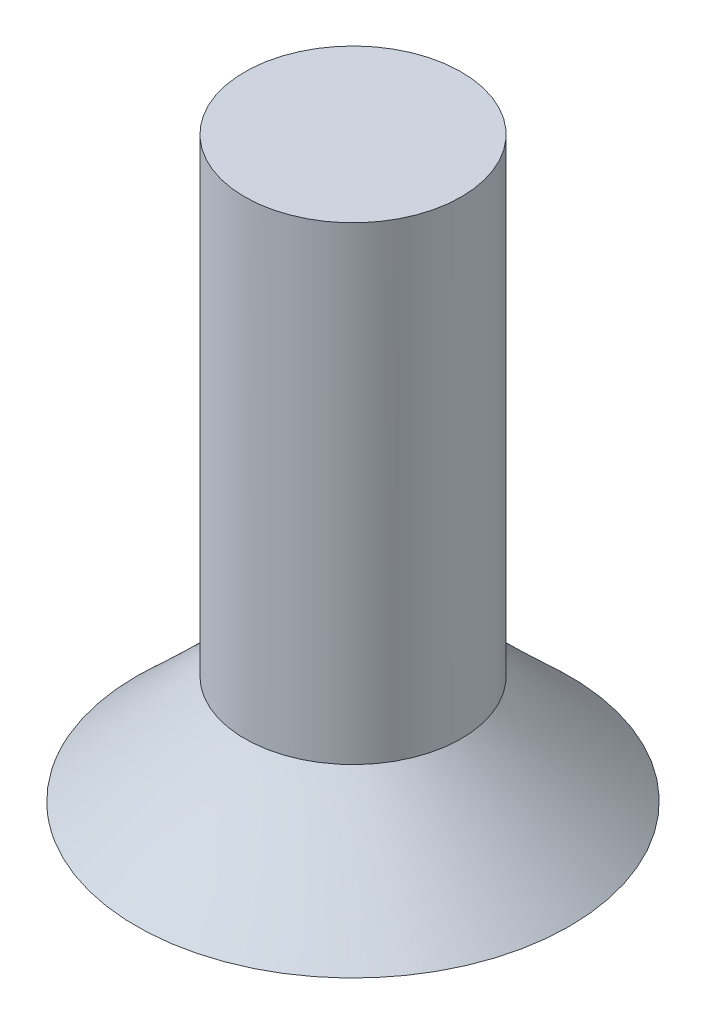
ISO-10303-21;
HEADER;
FILE_DESCRIPTION(('STEP AP214'),'2;1');
FILE_NAME('part.step','',(''),(''),'','','');
FILE_SCHEMA(('AUTOMOTIVE_DESIGN { 1 0 10303 214 1 1 1 1 }'));
ENDSEC;
DATA;
#1=APPLICATION_CONTEXT('core data for automotive mechanical design processes');
#2=APPLICATION_PROTOCOL_DEFINITION('international standard','automotive_design',2000,#1);
#3=PRODUCT_CONTEXT('',#1,'mechanical');
#4=PRODUCT('Part','Part','',(#3));
#5=PRODUCT_RELATED_PRODUCT_CATEGORY('part','',(#4));
#6=PRODUCT_DEFINITION_FORMATION('','',#4);
#7=PRODUCT_DEFINITION_CONTEXT('part definition',#1,'design');
#8=PRODUCT_DEFINITION('design','',#6,#7);
#9=PRODUCT_DEFINITION_SHAPE('','',#8);
#10=(LENGTH_UNIT() NAMED_UNIT(*) SI_UNIT(.MILLI.,.METRE.));
#11=(NAMED_UNIT(*) PLANE_ANGLE_UNIT() SI_UNIT($,.RADIAN.));
#12=(NAMED_UNIT(*) SI_UNIT($,.STERADIAN.) SOLID_ANGLE_UNIT());
#13=UNCERTAINTY_MEASURE_WITH_UNIT(LENGTH_MEASURE(1.E-05),#10,'distance_accuracy_value','');
#14=(GEOMETRIC_REPRESENTATION_CONTEXT(3) GLOBAL_UNCERTAINTY_ASSIGNED_CONTEXT((#13)) GLOBAL_UNIT_ASSIGNED_CONTEXT((#10,
#11,#12)) REPRESENTATION_CONTEXT('',''));
#15=CARTESIAN_POINT('',(0.,0.,0.));
#16=DIRECTION('',(0.,0.,1.));
#17=DIRECTION('',(1.,0.,0.));
#18=AXIS2_PLACEMENT_3D('',#15,#16,#17);
#19=CARTESIAN_POINT('',(0.,0.,0.));
#20=DIRECTION('',(0.,1.,0.));
#21=DIRECTION('',(0.,0.,1.));
#22=AXIS2_PLACEMENT_3D('',#19,#20,#21);
#23=PLANE('',#22);
#24=DIRECTION('',(-0.5,0.,0.866025403784439));
#25=VECTOR('',#24,1.);
#26=CARTESIAN_POINT('',(1.44337567297406,0.,0.));
#27=LINE('',#26,#25);
#28=CARTESIAN_POINT('',(1.44337567297406,0.,0.));
#29=VERTEX_POINT('',#28);
#30=CARTESIAN_POINT('',(0.721687836487033,0.,1.25));
#31=VERTEX_POINT('',#30);
#32=EDGE_CURVE('E151',#29,#31,#27,.T.);
#33=ORIENTED_EDGE('',*,*,#32,.F.);
#34=DIRECTION('',(0.5,0.,0.866025403784439));
#35=VECTOR('',#34,1.);
#36=CARTESIAN_POINT('',(0.721687836487032,0.,-1.25));
#37=LINE('',#36,#35);
#38=CARTESIAN_POINT('',(0.721687836487032,0.,-1.25));
#39=VERTEX_POINT('',#38);
#40=EDGE_CURVE('E72',#39,#29,#37,.T.);
#41=ORIENTED_EDGE('',*,*,#40,.F.);
#42=DIRECTION('',(1.,0.,0.));
#43=VECTOR('',#42,1.);
#44=CARTESIAN_POINT('',(-0.721687836487033,0.,-1.25));
#45=LINE('',#44,#43);
#46=CARTESIAN_POINT('',(-0.721687836487033,0.,-1.25));
#47=VERTEX_POINT('',#46);
#48=EDGE_CURVE('E163',#47,#39,#45,.T.);
#49=ORIENTED_EDGE('',*,*,#48,.F.);
#50=DIRECTION('',(0.5,0.,-0.866025403784439));
#51=VECTOR('',#50,1.);
#52=CARTESIAN_POINT('',(-1.44337567297406,0.,0.));
#53=LINE('',#52,#51);
#54=CARTESIAN_POINT('',(-1.44337567297406,0.,0.));
#55=VERTEX_POINT('',#54);
#56=EDGE_CURVE('E161',#55,#47,#53,.T.);
#57=ORIENTED_EDGE('',*,*,#56,.F.);
#58=DIRECTION('',(-0.5,0.,-0.866025403784439));
#59=VECTOR('',#58,1.);
#60=CARTESIAN_POINT('',(-0.721687836487032,0.,1.25));
#61=LINE('',#60,#59);
#62=CARTESIAN_POINT('',(-0.721687836487032,0.,1.25));
#63=VERTEX_POINT('',#62);
#64=EDGE_CURVE('E116',#63,#55,#61,.T.);
#65=ORIENTED_EDGE('',*,*,#64,.F.);
#66=DIRECTION('',(-1.,0.,0.));
#67=VECTOR('',#66,1.);
#68=CARTESIAN_POINT('',(0.721687836487033,0.,1.25));
#69=LINE('',#68,#67);
#70=EDGE_CURVE('E154',#31,#63,#69,.T.);
#71=ORIENTED_EDGE('',*,*,#70,.F.);
#72=EDGE_LOOP('',(#33,#41,#49,#57,#65,#71));
#73=FACE_BOUND('',#72,.T.);
#74=CARTESIAN_POINT('',(0.,0.,0.));
#75=DIRECTION('',(0.,1.,0.));
#76=DIRECTION('',(0.,0.,1.));
#77=AXIS2_PLACEMENT_3D('',#74,#75,#76);
#78=CIRCLE('',#77,3.);
#79=CARTESIAN_POINT('',(2.27999326585578,0.,-1.9497770917857));
#80=VERTEX_POINT('',#79);
#81=EDGE_CURVE('E61',#80,#80,#78,.T.);
#82=ORIENTED_EDGE('',*,*,#81,.F.);
#83=EDGE_LOOP('',(#82));
#84=FACE_BOUND('',#83,.T.);
#85=ADVANCED_FACE('F51',(#73,#84),#23,.F.);
#86=CARTESIAN_POINT('',(2.27999326585578,0.,-1.9497770917857));
#87=CARTESIAN_POINT('',(0.694387173597943,1.5,-1.32959634970267));
#88=CARTESIAN_POINT('',(-1.61956091771562,0.,-6.50976362349725));
#89=CARTESIAN_POINT('',(-1.9648055258074,1.5,-2.71837069689855));
#90=CARTESIAN_POINT('',(-6.17954744942717,0.,-2.61020943992586));
#91=CARTESIAN_POINT('',(-3.35357987300328,1.5,-0.0591779974932166));
#92=CARTESIAN_POINT('',(-2.27999326585578,0.,1.9497770917857));
#93=CARTESIAN_POINT('',(-0.694387173597942,1.5,1.32959634970267));
#94=CARTESIAN_POINT('',(1.61956091771562,0.,6.50976362349726));
#95=CARTESIAN_POINT('',(1.96480552580739,1.5,2.71837069689855));
#96=CARTESIAN_POINT('',(6.17954744942718,0.,2.61020943992586));
#97=CARTESIAN_POINT('',(3.35357987300328,1.5,0.0591779974932155));
#98=CARTESIAN_POINT('',(2.27999326585578,0.,-1.9497770917857));
#99=CARTESIAN_POINT('',(0.694387173597943,1.5,-1.32959634970267));
#100=(BOUNDED_SURFACE() B_SPLINE_SURFACE(3,1,((#86,#87),(#88,#89),(#90,#91),(#92,#93),(#94,#95),
(#96,#97),(#98,#99)),.UNSPECIFIED.,.T.,.F.,.F.) B_SPLINE_SURFACE_WITH_KNOTS((4,3,4),(2,2),(0.,
0.5,1.),(0.,1.),.UNSPECIFIED.) GEOMETRIC_REPRESENTATION_ITEM() RATIONAL_B_SPLINE_SURFACE(((1.,
1.),(0.333333333333334,0.333333333333333),(0.333333333333334,0.333333333333333),(1.,1.),
(0.333333333333333,0.333333333333333),(0.333333333333333,0.333333333333333),(1.,1.))) REPRESENTATION_ITEM('') SURFACE());
#101=CARTESIAN_POINT('',(0.,1.5,0.));
#102=DIRECTION('',(0.,1.,0.));
#103=DIRECTION('',(0.,0.,1.));
#104=AXIS2_PLACEMENT_3D('',#101,#102,#103);
#105=CIRCLE('',#104,1.5);
#106=CARTESIAN_POINT('',(0.694387173597943,1.5,-1.32959634970267));
#107=VERTEX_POINT('',#106);
#108=EDGE_CURVE('E12',#107,#107,#105,.T.);
#109=CARTESIAN_POINT('',(2.27999326585578,0.,-1.9497770917857));
#110=CARTESIAN_POINT('',(2.26347653572809,0.015625,-1.94331687572234));
#111=CARTESIAN_POINT('',(2.24695980560041,0.03125,-1.93685665965897));
#112=CARTESIAN_POINT('',(2.21392634534504,0.0625,-1.92393622753224));
#113=CARTESIAN_POINT('',(2.19740961521735,0.078125,-1.91747601146888));
#114=CARTESIAN_POINT('',(2.16437615496198,0.109375,-1.90455557934215));
#115=CARTESIAN_POINT('',(2.14785942483429,0.125,-1.89809536327878));
#116=CARTESIAN_POINT('',(2.11482596457892,0.15625,-1.88517493115205));
#117=CARTESIAN_POINT('',(2.09830923445123,0.171875,-1.87871471508869));
#118=CARTESIAN_POINT('',(2.06527577419586,0.203125,-1.86579428296196));
#119=CARTESIAN_POINT('',(2.04875904406818,0.21875,-1.85933406689859));
#120=CARTESIAN_POINT('',(2.01572558381281,0.25,-1.84641363477186));
#121=CARTESIAN_POINT('',(1.99920885368512,0.265625,-1.8399534187085));
#122=CARTESIAN_POINT('',(1.96617539342975,0.296875,-1.82703298658177));
#123=CARTESIAN_POINT('',(1.94965866330206,0.3125,-1.8205727705184));
#124=CARTESIAN_POINT('',(1.91662520304669,0.34375,-1.80765233839167));
#125=CARTESIAN_POINT('',(1.90010847291901,0.359375,-1.80119212232831));
#126=CARTESIAN_POINT('',(1.86707501266363,0.390625,-1.78827169020158));
#127=CARTESIAN_POINT('',(1.85055828253595,0.40625,-1.78181147413821));
#128=CARTESIAN_POINT('',(1.81752482228058,0.4375,-1.76889104201148));
#129=CARTESIAN_POINT('',(1.80100809215289,0.453125,-1.76243082594812));
#130=CARTESIAN_POINT('',(1.76797463189752,0.484375,-1.74951039382139));
#131=CARTESIAN_POINT('',(1.75145790176983,0.5,-1.74305017775802));
#132=CARTESIAN_POINT('',(1.71842444151446,0.53125,-1.73012974563129));
#133=CARTESIAN_POINT('',(1.70190771138678,0.546875,-1.72366952956793));
#134=CARTESIAN_POINT('',(1.6688742511314,0.578125,-1.7107490974412));
#135=CARTESIAN_POINT('',(1.65235752100372,0.59375,-1.70428888137783));
#136=CARTESIAN_POINT('',(1.61932406074835,0.625,-1.6913684492511));
#137=CARTESIAN_POINT('',(1.60280733062066,0.640625,-1.68490823318774));
#138=CARTESIAN_POINT('',(1.56977387036529,0.671875,-1.67198780106101));
#139=CARTESIAN_POINT('',(1.5532571402376,0.6875,-1.66552758499764));
#140=CARTESIAN_POINT('',(1.52022367998223,0.71875,-1.65260715287091));
#141=CARTESIAN_POINT('',(1.50370694985455,0.734375,-1.64614693680755));
#142=CARTESIAN_POINT('',(1.47067348959917,0.765625,-1.63322650468082));
#143=CARTESIAN_POINT('',(1.45415675947149,0.78125,-1.62676628861745));
#144=CARTESIAN_POINT('',(1.42112329921612,0.8125,-1.61384585649072));
#145=CARTESIAN_POINT('',(1.40460656908843,0.828125,-1.60738564042736));
#146=CARTESIAN_POINT('',(1.37157310883306,0.859375,-1.59446520830063));
#147=CARTESIAN_POINT('',(1.35505637870537,0.875,-1.58800499223726));
#148=CARTESIAN_POINT('',(1.32202291845,0.90625,-1.57508456011054));
#149=CARTESIAN_POINT('',(1.30550618832232,0.921875,-1.56862434404717));
#150=CARTESIAN_POINT('',(1.27247272806695,0.953125,-1.55570391192044));
#151=CARTESIAN_POINT('',(1.25595599793926,0.96875,-1.54924369585708));
#152=CARTESIAN_POINT('',(1.22292253768389,1.,-1.53632326373035));
#153=CARTESIAN_POINT('',(1.2064058075562,1.015625,-1.52986304766698));
#154=CARTESIAN_POINT('',(1.17337234730083,1.046875,-1.51694261554025));
#155=CARTESIAN_POINT('',(1.15685561717314,1.0625,-1.51048239947689));
#156=CARTESIAN_POINT('',(1.12382215691777,1.09375,-1.49756196735016));
#157=CARTESIAN_POINT('',(1.10730542679009,1.109375,-1.49110175128679));
#158=CARTESIAN_POINT('',(1.07427196653472,1.140625,-1.47818131916006));
#159=CARTESIAN_POINT('',(1.05775523640703,1.15625,-1.4717211030967));
#160=CARTESIAN_POINT('',(1.02472177615166,1.1875,-1.45880067096997));
#161=CARTESIAN_POINT('',(1.00820504602397,1.203125,-1.4523404549066));
#162=CARTESIAN_POINT('',(0.975171585768601,1.234375,-1.43942002277987));
#163=CARTESIAN_POINT('',(0.958654855640915,1.25,-1.43295980671651));
#164=CARTESIAN_POINT('',(0.925621395385544,1.28125,-1.42003937458978));
#165=CARTESIAN_POINT('',(0.909104665257858,1.296875,-1.41357915852641));
#166=CARTESIAN_POINT('',(0.876071205002486,1.328125,-1.40065872639968));
#167=CARTESIAN_POINT('',(0.859554474874801,1.34375,-1.39419851033632));
#168=CARTESIAN_POINT('',(0.826521014619429,1.375,-1.38127807820959));
#169=CARTESIAN_POINT('',(0.810004284491743,1.390625,-1.37481786214622));
#170=CARTESIAN_POINT('',(0.776970824236372,1.421875,-1.36189743001949));
#171=CARTESIAN_POINT('',(0.760454094108686,1.4375,-1.35543721395613));
#172=CARTESIAN_POINT('',(0.727420633853314,1.46875,-1.3425167818294));
#173=CARTESIAN_POINT('',(0.710903903725628,1.484375,-1.33605656576603));
#174=CARTESIAN_POINT('',(0.694387173597943,1.5,-1.32959634970267));
#175=B_SPLINE_CURVE_WITH_KNOTS('',3,(#109,#110,#111,#112,#113,#114,#115,#116,#117,#118,#119,
#120,#121,#122,#123,#124,#125,#126,#127,#128,#129,#130,#131,#132,#133,#134,#135,#136,#137,#138,
#139,#140,#141,#142,#143,#144,#145,#146,#147,#148,#149,#150,#151,#152,#153,#154,#155,#156,#157,
#158,#159,#160,#161,#162,#163,#164,#165,#166,#167,#168,#169,#170,#171,#172,#173,#174),
.UNSPECIFIED.,.F.,.F.,(4,2,2,2,2,2,2,2,2,2,2,2,2,2,2,2,2,2,2,2,2,2,2,2,2,2,2,2,2,2,2,2,4),(0.,
0.0709090721717993,0.141818144343599,0.212727216515398,0.283636288687198,0.354545360858997,
0.425454433030796,0.496363505202596,0.567272577374395,0.638181649546194,0.709090721717994,
0.779999793889793,0.850908866061593,0.921817938233392,0.992727010405191,1.06363608257699,
1.13454515474879,1.20545422692059,1.27636329909239,1.34727237126419,1.41818144343599,
1.48909051560779,1.55999958777959,1.63090865995139,1.70181773212319,1.77272680429498,
1.84363587646678,1.91454494863858,1.98545402081038,2.05636309298218,2.12727216515398,
2.19818123732578,2.26909030949758),.UNSPECIFIED.);
#176=EDGE_CURVE('BSEAM52',#80,#107,#175,.T.);
#177=ORIENTED_EDGE('',*,*,#81,.T.);
#178=ORIENTED_EDGE('',*,*,#108,.F.);
#179=ORIENTED_EDGE('',*,*,#176,.T.);
#180=ORIENTED_EDGE('',*,*,#176,.F.);
#181=EDGE_LOOP('',(#177,#179,#178,#180));
#182=FACE_BOUND('',#181,.T.);
#183=ADVANCED_FACE('F52',(#182),#100,.T.);
#184=CARTESIAN_POINT('',(0.,8.,0.));
#185=DIRECTION('',(0.,-1.,0.));
#186=DIRECTION('',(0.,0.,-1.));
#187=AXIS2_PLACEMENT_3D('',#184,#185,#186);
#188=CYLINDRICAL_SURFACE('',#187,1.5);
#189=CARTESIAN_POINT('',(0.,8.,0.));
#190=DIRECTION('',(0.,1.,0.));
#191=DIRECTION('',(0.,0.,1.));
#192=AXIS2_PLACEMENT_3D('',#189,#190,#191);
#193=CIRCLE('',#192,1.5);
#194=CARTESIAN_POINT('',(0.,8.,1.5));
#195=VERTEX_POINT('',#194);
#196=EDGE_CURVE('E168',#195,#195,#193,.T.);
#197=ORIENTED_EDGE('',*,*,#196,.F.);
#198=EDGE_LOOP('',(#197));
#199=FACE_BOUND('',#198,.T.);
#200=ORIENTED_EDGE('',*,*,#108,.T.);
#201=EDGE_LOOP('',(#200));
#202=FACE_BOUND('',#201,.T.);
#203=ADVANCED_FACE('F222',(#199,#202),#188,.T.);
#204=CARTESIAN_POINT('',(0.,8.,0.));
#205=DIRECTION('',(0.,1.,0.));
#206=DIRECTION('',(0.,0.,1.));
#207=AXIS2_PLACEMENT_3D('',#204,#205,#206);
#208=PLANE('',#207);
#209=ORIENTED_EDGE('',*,*,#196,.T.);
#210=EDGE_LOOP('',(#209));
#211=FACE_BOUND('',#210,.T.);
#212=ADVANCED_FACE('F223',(#211),#208,.T.);
#213=CARTESIAN_POINT('',(0.721687836487032,1.,-1.25));
#214=DIRECTION('',(0.866025403784439,0.,-0.5));
#215=DIRECTION('',(-0.5,0.,-0.866025403784439));
#216=AXIS2_PLACEMENT_3D('',#213,#214,#215);
#217=PLANE('',#216);
#218=ORIENTED_EDGE('',*,*,#40,.T.);
#219=DIRECTION('',(0.,-1.,0.));
#220=VECTOR('',#219,1.);
#221=CARTESIAN_POINT('',(1.44337567297406,1.,0.));
#222=LINE('',#221,#220);
#223=CARTESIAN_POINT('',(1.44337567297406,1.,0.));
#224=VERTEX_POINT('',#223);
#225=EDGE_CURVE('E101',#224,#29,#222,.T.);
#226=ORIENTED_EDGE('',*,*,#225,.F.);
#227=DIRECTION('',(0.5,0.,0.866025403784439));
#228=VECTOR('',#227,1.);
#229=CARTESIAN_POINT('',(0.721687836487032,1.,-1.25));
#230=LINE('',#229,#228);
#231=CARTESIAN_POINT('',(0.721687836487032,1.,-1.25));
#232=VERTEX_POINT('',#231);
#233=EDGE_CURVE('E170',#232,#224,#230,.T.);
#234=ORIENTED_EDGE('',*,*,#233,.F.);
#235=DIRECTION('',(0.,-1.,0.));
#236=VECTOR('',#235,1.);
#237=CARTESIAN_POINT('',(0.721687836487032,1.,-1.25));
#238=LINE('',#237,#236);
#239=EDGE_CURVE('E76',#232,#39,#238,.T.);
#240=ORIENTED_EDGE('',*,*,#239,.T.);
#241=EDGE_LOOP('',(#218,#226,#234,#240));
#242=FACE_BOUND('',#241,.T.);
#243=ADVANCED_FACE('F238',(#242),#217,.F.);
#244=CARTESIAN_POINT('',(-0.721687836487033,1.,-1.25));
#245=DIRECTION('',(0.,0.,-1.));
#246=DIRECTION('',(-1.,0.,0.));
#247=AXIS2_PLACEMENT_3D('',#244,#245,#246);
#248=PLANE('',#247);
#249=ORIENTED_EDGE('',*,*,#48,.T.);
#250=ORIENTED_EDGE('',*,*,#239,.F.);
#251=DIRECTION('',(1.,0.,0.));
#252=VECTOR('',#251,1.);
#253=CARTESIAN_POINT('',(-0.721687836487033,1.,-1.25));
#254=LINE('',#253,#252);
#255=CARTESIAN_POINT('',(-0.721687836487033,1.,-1.25));
#256=VERTEX_POINT('',#255);
#257=EDGE_CURVE('E134',#256,#232,#254,.T.);
#258=ORIENTED_EDGE('',*,*,#257,.F.);
#259=DIRECTION('',(0.,-1.,0.));
#260=VECTOR('',#259,1.);
#261=CARTESIAN_POINT('',(-0.721687836487033,1.,-1.25));
#262=LINE('',#261,#260);
#263=EDGE_CURVE('E125',#256,#47,#262,.T.);
#264=ORIENTED_EDGE('',*,*,#263,.T.);
#265=EDGE_LOOP('',(#249,#250,#258,#264));
#266=FACE_BOUND('',#265,.T.);
#267=ADVANCED_FACE('F241',(#266),#248,.F.);
#268=CARTESIAN_POINT('',(-1.44337567297406,1.,0.));
#269=DIRECTION('',(-0.866025403784439,0.,-0.5));
#270=DIRECTION('',(-0.5,0.,0.866025403784439));
#271=AXIS2_PLACEMENT_3D('',#268,#269,#270);
#272=PLANE('',#271);
#273=ORIENTED_EDGE('',*,*,#56,.T.);
#274=ORIENTED_EDGE('',*,*,#263,.F.);
#275=DIRECTION('',(0.5,0.,-0.866025403784439));
#276=VECTOR('',#275,1.);
#277=CARTESIAN_POINT('',(-1.44337567297406,1.,0.));
#278=LINE('',#277,#276);
#279=CARTESIAN_POINT('',(-1.44337567297406,1.,0.));
#280=VERTEX_POINT('',#279);
#281=EDGE_CURVE('E126',#280,#256,#278,.T.);
#282=ORIENTED_EDGE('',*,*,#281,.F.);
#283=DIRECTION('',(0.,-1.,0.));
#284=VECTOR('',#283,1.);
#285=CARTESIAN_POINT('',(-1.44337567297406,1.,0.));
#286=LINE('',#285,#284);
#287=EDGE_CURVE('E115',#280,#55,#286,.T.);
#288=ORIENTED_EDGE('',*,*,#287,.T.);
#289=EDGE_LOOP('',(#273,#274,#282,#288));
#290=FACE_BOUND('',#289,.T.);
#291=ADVANCED_FACE('F129',(#290),#272,.F.);
#292=CARTESIAN_POINT('',(-0.721687836487032,1.,1.25));
#293=DIRECTION('',(-0.866025403784439,0.,0.5));
#294=DIRECTION('',(0.5,0.,0.866025403784439));
#295=AXIS2_PLACEMENT_3D('',#292,#293,#294);
#296=PLANE('',#295);
#297=ORIENTED_EDGE('',*,*,#64,.T.);
#298=ORIENTED_EDGE('',*,*,#287,.F.);
#299=DIRECTION('',(-0.5,0.,-0.866025403784439));
#300=VECTOR('',#299,1.);
#301=CARTESIAN_POINT('',(-0.721687836487032,1.,1.25));
#302=LINE('',#301,#300);
#303=CARTESIAN_POINT('',(-0.721687836487032,1.,1.25));
#304=VERTEX_POINT('',#303);
#305=EDGE_CURVE('E117',#304,#280,#302,.T.);
#306=ORIENTED_EDGE('',*,*,#305,.F.);
#307=DIRECTION('',(0.,-1.,0.));
#308=VECTOR('',#307,1.);
#309=CARTESIAN_POINT('',(-0.721687836487032,1.,1.25));
#310=LINE('',#309,#308);
#311=EDGE_CURVE('E121',#304,#63,#310,.T.);
#312=ORIENTED_EDGE('',*,*,#311,.T.);
#313=EDGE_LOOP('',(#297,#298,#306,#312));
#314=FACE_BOUND('',#313,.T.);
#315=ADVANCED_FACE('F111',(#314),#296,.F.);
#316=CARTESIAN_POINT('',(0.721687836487033,1.,1.25));
#317=DIRECTION('',(0.,0.,1.));
#318=DIRECTION('',(1.,0.,0.));
#319=AXIS2_PLACEMENT_3D('',#316,#317,#318);
#320=PLANE('',#319);
#321=ORIENTED_EDGE('',*,*,#70,.T.);
#322=ORIENTED_EDGE('',*,*,#311,.F.);
#323=DIRECTION('',(-1.,0.,0.));
#324=VECTOR('',#323,1.);
#325=CARTESIAN_POINT('',(0.721687836487033,1.,1.25));
#326=LINE('',#325,#324);
#327=CARTESIAN_POINT('',(0.721687836487033,1.,1.25));
#328=VERTEX_POINT('',#327);
#329=EDGE_CURVE('E140',#328,#304,#326,.T.);
#330=ORIENTED_EDGE('',*,*,#329,.F.);
#331=DIRECTION('',(0.,-1.,0.));
#332=VECTOR('',#331,1.);
#333=CARTESIAN_POINT('',(0.721687836487033,1.,1.25));
#334=LINE('',#333,#332);
#335=EDGE_CURVE('E173',#328,#31,#334,.T.);
#336=ORIENTED_EDGE('',*,*,#335,.T.);
#337=EDGE_LOOP('',(#321,#322,#330,#336));
#338=FACE_BOUND('',#337,.T.);
#339=ADVANCED_FACE('F247',(#338),#320,.F.);
#340=CARTESIAN_POINT('',(1.44337567297406,1.,0.));
#341=DIRECTION('',(0.866025403784439,0.,0.5));
#342=DIRECTION('',(0.5,0.,-0.866025403784439));
#343=AXIS2_PLACEMENT_3D('',#340,#341,#342);
#344=PLANE('',#343);
#345=ORIENTED_EDGE('',*,*,#32,.T.);
#346=ORIENTED_EDGE('',*,*,#335,.F.);
#347=DIRECTION('',(-0.5,0.,0.866025403784439));
#348=VECTOR('',#347,1.);
#349=CARTESIAN_POINT('',(1.44337567297406,1.,0.));
#350=LINE('',#349,#348);
#351=EDGE_CURVE('E141',#224,#328,#350,.T.);
#352=ORIENTED_EDGE('',*,*,#351,.F.);
#353=ORIENTED_EDGE('',*,*,#225,.T.);
#354=EDGE_LOOP('',(#345,#346,#352,#353));
#355=FACE_BOUND('',#354,.T.);
#356=ADVANCED_FACE('F243',(#355),#344,.F.);
#357=CARTESIAN_POINT('',(0.,1.,0.));
#358=DIRECTION('',(0.,-1.,0.));
#359=DIRECTION('',(0.,0.,-1.));
#360=AXIS2_PLACEMENT_3D('',#357,#358,#359);
#361=PLANE('',#360);
#362=ORIENTED_EDGE('',*,*,#233,.T.);
#363=ORIENTED_EDGE('',*,*,#351,.T.);
#364=ORIENTED_EDGE('',*,*,#329,.T.);
#365=ORIENTED_EDGE('',*,*,#305,.T.);
#366=ORIENTED_EDGE('',*,*,#281,.T.);
#367=ORIENTED_EDGE('',*,*,#257,.T.);
#368=EDGE_LOOP('',(#362,#363,#364,#365,#366,#367));
#369=FACE_BOUND('',#368,.T.);
#370=ADVANCED_FACE('F138',(#369),#361,.T.);
#371=CLOSED_SHELL('',(#85,#183,#203,#212,#243,#267,#291,#315,#339,#356,#370));
#372=MANIFOLD_SOLID_BREP('B2',#371);
#373=ADVANCED_BREP_SHAPE_REPRESENTATION('',(#18,#372),#14);
#374=SHAPE_DEFINITION_REPRESENTATION(#9,#373);
ENDSEC;
END-ISO-10303-21;
